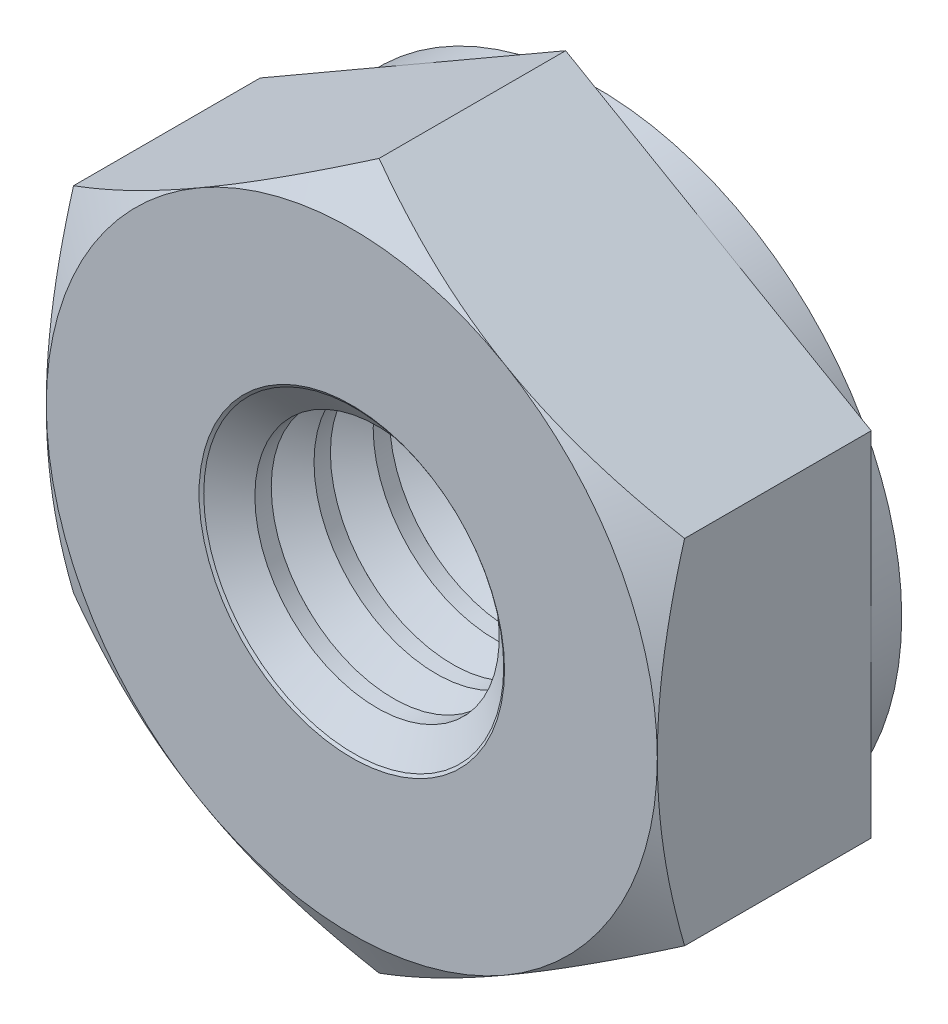
ISO-10303-21;
HEADER;
FILE_DESCRIPTION(('STEP AP214'),'2;1');
FILE_NAME('part.step','',(''),(''),'','','');
FILE_SCHEMA(('AUTOMOTIVE_DESIGN { 1 0 10303 214 1 1 1 1 }'));
ENDSEC;
DATA;
#1=APPLICATION_CONTEXT('core data for automotive mechanical design processes');
#2=APPLICATION_PROTOCOL_DEFINITION('international standard','automotive_design',2000,#1);
#3=PRODUCT_CONTEXT('',#1,'mechanical');
#4=PRODUCT('Part','Part','',(#3));
#5=PRODUCT_RELATED_PRODUCT_CATEGORY('part','',(#4));
#6=PRODUCT_DEFINITION_FORMATION('','',#4);
#7=PRODUCT_DEFINITION_CONTEXT('part definition',#1,'design');
#8=PRODUCT_DEFINITION('design','',#6,#7);
#9=PRODUCT_DEFINITION_SHAPE('','',#8);
#10=(LENGTH_UNIT() NAMED_UNIT(*) SI_UNIT(.MILLI.,.METRE.));
#11=(NAMED_UNIT(*) PLANE_ANGLE_UNIT() SI_UNIT($,.RADIAN.));
#12=(NAMED_UNIT(*) SI_UNIT($,.STERADIAN.) SOLID_ANGLE_UNIT());
#13=UNCERTAINTY_MEASURE_WITH_UNIT(LENGTH_MEASURE(1.E-05),#10,'distance_accuracy_value','');
#14=(GEOMETRIC_REPRESENTATION_CONTEXT(3) GLOBAL_UNCERTAINTY_ASSIGNED_CONTEXT((#13)) GLOBAL_UNIT_ASSIGNED_CONTEXT((#10,
#11,#12)) REPRESENTATION_CONTEXT('',''));
#15=CARTESIAN_POINT('',(0.,0.,0.));
#16=DIRECTION('',(0.,0.,1.));
#17=DIRECTION('',(1.,0.,0.));
#18=AXIS2_PLACEMENT_3D('',#15,#16,#17);
#19=CARTESIAN_POINT('',(0.,0.,-1.6));
#20=DIRECTION('',(0.,0.,1.));
#21=DIRECTION('',(1.,0.,0.));
#22=AXIS2_PLACEMENT_3D('',#19,#20,#21);
#23=CYLINDRICAL_SURFACE('',#22,0.8);
#24=CARTESIAN_POINT('',(0.,0.,-1.32734150764194));
#25=DIRECTION('',(0.,0.,-1.));
#26=DIRECTION('',(-1.,0.,0.));
#27=AXIS2_PLACEMENT_3D('',#24,#25,#26);
#28=CIRCLE('',#27,0.8);
#29=CARTESIAN_POINT('',(-0.8,0.,-1.32734150764194));
#30=VERTEX_POINT('',#29);
#31=EDGE_CURVE('E610',#30,#30,#28,.T.);
#32=ORIENTED_EDGE('',*,*,#31,.F.);
#33=EDGE_LOOP('',(#32));
#34=FACE_BOUND('',#33,.T.);
#35=CARTESIAN_POINT('',(0.,0.,-1.43455849235806));
#36=DIRECTION('',(0.,0.,-1.));
#37=DIRECTION('',(-1.,0.,0.));
#38=AXIS2_PLACEMENT_3D('',#35,#36,#37);
#39=CIRCLE('',#38,0.8);
#40=CARTESIAN_POINT('',(-0.8,0.,-1.43455849235806));
#41=VERTEX_POINT('',#40);
#42=EDGE_CURVE('E272',#41,#41,#39,.F.);
#43=ORIENTED_EDGE('',*,*,#42,.F.);
#44=EDGE_LOOP('',(#43));
#45=FACE_BOUND('',#44,.T.);
#46=ADVANCED_FACE('F35',(#34,#45),#23,.F.);
#47=CARTESIAN_POINT('',(0.,0.,-1.04725849235806));
#48=DIRECTION('',(0.,0.,-1.));
#49=DIRECTION('',(-1.,0.,0.));
#50=AXIS2_PLACEMENT_3D('',#47,#48,#49);
#51=CIRCLE('',#50,0.8);
#52=CARTESIAN_POINT('',(-0.8,0.,-1.04725849235806));
#53=VERTEX_POINT('',#52);
#54=EDGE_CURVE('E611',#53,#53,#51,.T.);
#55=ORIENTED_EDGE('',*,*,#54,.T.);
#56=EDGE_LOOP('',(#55));
#57=FACE_BOUND('',#56,.T.);
#58=CARTESIAN_POINT('',(0.,0.,-0.940041507641944));
#59=DIRECTION('',(0.,0.,-1.));
#60=DIRECTION('',(-1.,0.,0.));
#61=AXIS2_PLACEMENT_3D('',#58,#59,#60);
#62=CIRCLE('',#61,0.8);
#63=CARTESIAN_POINT('',(-0.8,0.,-0.940041507641944));
#64=VERTEX_POINT('',#63);
#65=EDGE_CURVE('E620',#64,#64,#62,.T.);
#66=ORIENTED_EDGE('',*,*,#65,.F.);
#67=EDGE_LOOP('',(#66));
#68=FACE_BOUND('',#67,.T.);
#69=ADVANCED_FACE('F228',(#57,#68),#23,.F.);
#70=CARTESIAN_POINT('',(0.,0.,-0.659958492358061));
#71=DIRECTION('',(0.,0.,-1.));
#72=DIRECTION('',(-1.,0.,0.));
#73=AXIS2_PLACEMENT_3D('',#70,#71,#72);
#74=CIRCLE('',#73,0.8);
#75=CARTESIAN_POINT('',(-0.8,0.,-0.659958492358061));
#76=VERTEX_POINT('',#75);
#77=EDGE_CURVE('E613',#76,#76,#74,.T.);
#78=ORIENTED_EDGE('',*,*,#77,.T.);
#79=EDGE_LOOP('',(#78));
#80=FACE_BOUND('',#79,.T.);
#81=CARTESIAN_POINT('',(0.,0.,-0.552741507641944));
#82=DIRECTION('',(0.,0.,-1.));
#83=DIRECTION('',(-1.,0.,0.));
#84=AXIS2_PLACEMENT_3D('',#81,#82,#83);
#85=CIRCLE('',#84,0.8);
#86=CARTESIAN_POINT('',(-0.8,0.,-0.552741507641944));
#87=VERTEX_POINT('',#86);
#88=EDGE_CURVE('E263',#87,#87,#85,.T.);
#89=ORIENTED_EDGE('',*,*,#88,.F.);
#90=EDGE_LOOP('',(#89));
#91=FACE_BOUND('',#90,.T.);
#92=ADVANCED_FACE('F235',(#80,#91),#23,.F.);
#93=CARTESIAN_POINT('',(0.,0.,-0.272658492358061));
#94=DIRECTION('',(0.,0.,-1.));
#95=DIRECTION('',(-1.,0.,0.));
#96=AXIS2_PLACEMENT_3D('',#93,#94,#95);
#97=CIRCLE('',#96,0.8);
#98=CARTESIAN_POINT('',(-0.8,0.,-0.272658492358061));
#99=VERTEX_POINT('',#98);
#100=EDGE_CURVE('E252',#99,#99,#97,.T.);
#101=ORIENTED_EDGE('',*,*,#100,.T.);
#102=EDGE_LOOP('',(#101));
#103=FACE_BOUND('',#102,.T.);
#104=CARTESIAN_POINT('',(0.,0.,-0.165441507641944));
#105=DIRECTION('',(0.,0.,-1.));
#106=DIRECTION('',(-1.,0.,0.));
#107=AXIS2_PLACEMENT_3D('',#104,#105,#106);
#108=CIRCLE('',#107,0.8);
#109=CARTESIAN_POINT('',(-0.8,0.,-0.165441507641944));
#110=VERTEX_POINT('',#109);
#111=EDGE_CURVE('E255',#110,#110,#108,.T.);
#112=ORIENTED_EDGE('',*,*,#111,.F.);
#113=EDGE_LOOP('',(#112));
#114=FACE_BOUND('',#113,.T.);
#115=ADVANCED_FACE('F231',(#103,#114),#23,.F.);
#116=CARTESIAN_POINT('',(-3.99999999999995,0.,-1.6));
#117=DIRECTION('',(0.,0.,1.));
#118=DIRECTION('',(1.,0.,0.));
#119=AXIS2_PLACEMENT_3D('',#116,#117,#118);
#120=PLANE('',#119);
#121=CARTESIAN_POINT('',(0.,0.,-1.6));
#122=DIRECTION('',(0.,0.,1.));
#123=DIRECTION('',(1.,0.,0.));
#124=AXIS2_PLACEMENT_3D('',#121,#122,#123);
#125=CIRCLE('',#124,2.);
#126=CARTESIAN_POINT('',(2.,0.,-1.6));
#127=VERTEX_POINT('',#126);
#128=EDGE_CURVE('E285',#127,#127,#125,.F.);
#129=ORIENTED_EDGE('',*,*,#128,.T.);
#130=EDGE_LOOP('',(#129));
#131=FACE_BOUND('',#130,.T.);
#132=CARTESIAN_POINT('',(0.,0.,-1.6));
#133=DIRECTION('',(0.,0.,1.));
#134=DIRECTION('',(1.,0.,0.));
#135=AXIS2_PLACEMENT_3D('',#132,#133,#134);
#136=CIRCLE('',#135,1.);
#137=CARTESIAN_POINT('',(1.,0.,-1.6));
#138=VERTEX_POINT('',#137);
#139=EDGE_CURVE('E270',#138,#138,#136,.F.);
#140=ORIENTED_EDGE('',*,*,#139,.F.);
#141=EDGE_LOOP('',(#140));
#142=FACE_BOUND('',#141,.T.);
#143=ADVANCED_FACE('F241',(#131,#142),#120,.F.);
#144=CARTESIAN_POINT('',(-3.99999999999995,0.,0.));
#145=DIRECTION('',(0.,0.,1.));
#146=DIRECTION('',(1.,0.,0.));
#147=AXIS2_PLACEMENT_3D('',#144,#145,#146);
#148=PLANE('',#147);
#149=CARTESIAN_POINT('',(0.,0.,0.));
#150=DIRECTION('',(0.,0.,1.));
#151=DIRECTION('',(1.,0.,0.));
#152=AXIS2_PLACEMENT_3D('',#149,#150,#151);
#153=CIRCLE('',#152,2.);
#154=CARTESIAN_POINT('',(2.,0.,0.));
#155=VERTEX_POINT('',#154);
#156=CARTESIAN_POINT('',(1.00000000000002,-1.73205080756887,0.));
#157=VERTEX_POINT('',#156);
#158=EDGE_CURVE('E11',#155,#157,#153,.F.);
#159=ORIENTED_EDGE('',*,*,#158,.F.);
#160=CARTESIAN_POINT('',(0.,0.,0.));
#161=DIRECTION('',(0.,0.,1.));
#162=DIRECTION('',(1.,0.,0.));
#163=AXIS2_PLACEMENT_3D('',#160,#161,#162);
#164=CIRCLE('',#163,2.);
#165=CARTESIAN_POINT('',(1.00000000000002,1.73205080756886,0.));
#166=VERTEX_POINT('',#165);
#167=EDGE_CURVE('E144',#155,#166,#164,.T.);
#168=ORIENTED_EDGE('',*,*,#167,.T.);
#169=CARTESIAN_POINT('',(-1.00000000000002,1.73205080756887,0.));
#170=VERTEX_POINT('',#169);
#171=EDGE_CURVE('E47',#170,#166,#153,.F.);
#172=ORIENTED_EDGE('',*,*,#171,.F.);
#173=CARTESIAN_POINT('',(-2.,0.,0.));
#174=VERTEX_POINT('',#173);
#175=EDGE_CURVE('E349',#174,#170,#153,.F.);
#176=ORIENTED_EDGE('',*,*,#175,.F.);
#177=CARTESIAN_POINT('',(-1.00000000000003,-1.73205080756886,0.));
#178=VERTEX_POINT('',#177);
#179=EDGE_CURVE('E350',#178,#174,#153,.F.);
#180=ORIENTED_EDGE('',*,*,#179,.F.);
#181=EDGE_CURVE('E45',#157,#178,#153,.F.);
#182=ORIENTED_EDGE('',*,*,#181,.F.);
#183=EDGE_LOOP('',(#159,#168,#172,#176,#180,#182));
#184=FACE_BOUND('',#183,.T.);
#185=CARTESIAN_POINT('',(0.,0.,0.));
#186=DIRECTION('',(0.,0.,1.));
#187=DIRECTION('',(1.,0.,0.));
#188=AXIS2_PLACEMENT_3D('',#185,#186,#187);
#189=CIRCLE('',#188,1.);
#190=CARTESIAN_POINT('',(1.,0.,0.));
#191=VERTEX_POINT('',#190);
#192=EDGE_CURVE('E152',#191,#191,#189,.T.);
#193=ORIENTED_EDGE('',*,*,#192,.F.);
#194=EDGE_LOOP('',(#193));
#195=FACE_BOUND('',#194,.T.);
#196=ADVANCED_FACE('F154',(#184,#195),#148,.T.);
#197=CARTESIAN_POINT('',(0.,2.30940107675852,-1.6));
#198=DIRECTION('',(-0.50000000000001,0.866025403784433,0.));
#199=DIRECTION('',(-0.866025403784433,-0.50000000000001,0.));
#200=AXIS2_PLACEMENT_3D('',#197,#198,#199);
#201=PLANE('',#200);
#202=DIRECTION('',(0.,0.,1.));
#203=VECTOR('',#202,1.);
#204=CARTESIAN_POINT('',(-2.,1.15470053837924,-1.6));
#205=LINE('',#204,#203);
#206=CARTESIAN_POINT('',(-2.,1.15470053837924,-1.4));
#207=VERTEX_POINT('',#206);
#208=CARTESIAN_POINT('',(-2.,1.15470053837924,-0.17863279495409));
#209=VERTEX_POINT('',#208);
#210=EDGE_CURVE('E289',#207,#209,#205,.T.);
#211=ORIENTED_EDGE('',*,*,#210,.T.);
#212=CARTESIAN_POINT('',(-2.0002,1.1545850683254,-0.178699466620493));
#213=CARTESIAN_POINT('',(-1.91230873709994,1.20532911262017,-0.149389536100674));
#214=CARTESIAN_POINT('',(-1.82365880552641,1.25651117447779,-0.122732851980462));
#215=CARTESIAN_POINT('',(-1.6448237530022,1.35976164019318,-0.0762024910207172));
#216=CARTESIAN_POINT('',(-1.55463545349497,1.41183187919144,-0.0563452763827756));
#217=CARTESIAN_POINT('',(-1.3753766142367,1.51532701829182,-0.0254334640232498));
#218=CARTESIAN_POINT('',(-1.2863336617737,1.56673599086578,-0.014173151598529));
#219=CARTESIAN_POINT('',(-1.10782860221496,1.66979593505373,-0.000728662594640663));
#220=CARTESIAN_POINT('',(-1.01836714429605,1.72144653186531,0.00146664504653274));
#221=CARTESIAN_POINT('',(-0.851191646451209,1.81796535054794,-0.00309098933064855));
#222=CARTESIAN_POINT('',(-0.773452629734223,1.86284799277603,-0.00872487468701488));
#223=CARTESIAN_POINT('',(-0.618481085463872,1.95232085557725,-0.02658389526083));
#224=CARTESIAN_POINT('',(-0.541249094258806,1.99691076648955,-0.0388151360234418));
#225=CARTESIAN_POINT('',(-0.385957813517802,2.08656822922817,-0.069393436867614));
#226=CARTESIAN_POINT('',(-0.307918186892623,2.13162442866768,-0.087870167065721));
#227=CARTESIAN_POINT('',(-0.153003134307866,2.22106467597901,-0.129805518212863));
#228=CARTESIAN_POINT('',(-0.0761257223768796,2.26544987045197,-0.153254280492322));
#229=CARTESIAN_POINT('',(0.000200000000001074,2.30951654681236,-0.178699466620507));
#230=B_SPLINE_CURVE_WITH_KNOTS('',3,(#212,#213,#214,#215,#216,#217,#218,#219,#220,#221,#222,
#223,#224,#225,#226,#227,#228,#229),.UNSPECIFIED.,.F.,.F.,(4,2,2,2,2,2,2,2,4),(0.,
0.317031824695609,0.634825876346562,0.944753967652633,1.25430138000371,1.52387047293094,
1.79368946861029,2.06949491027635,2.34475850821474),.UNSPECIFIED.);
#231=EDGE_CURVE('E138',#209,#170,#230,.T.);
#232=ORIENTED_EDGE('',*,*,#231,.T.);
#233=CARTESIAN_POINT('',(0.,2.30940107675852,-0.17863279495409));
#234=VERTEX_POINT('',#233);
#235=EDGE_CURVE('E166',#170,#234,#230,.T.);
#236=ORIENTED_EDGE('',*,*,#235,.T.);
#237=DIRECTION('',(0.,0.,1.));
#238=VECTOR('',#237,1.);
#239=CARTESIAN_POINT('',(0.,2.30940107675852,-1.6));
#240=LINE('',#239,#238);
#241=CARTESIAN_POINT('',(0.,2.30940107675852,-1.4));
#242=VERTEX_POINT('',#241);
#243=EDGE_CURVE('E288',#242,#234,#240,.T.);
#244=ORIENTED_EDGE('',*,*,#243,.F.);
#245=DIRECTION('',(-0.866025403784433,-0.50000000000001,0.));
#246=VECTOR('',#245,1.);
#247=CARTESIAN_POINT('',(0.,2.30940107675852,-1.4));
#248=LINE('',#247,#246);
#249=CARTESIAN_POINT('',(-1.00000000000002,1.73205080756887,-1.40000000000001));
#250=VERTEX_POINT('',#249);
#251=EDGE_CURVE('E317',#242,#250,#248,.T.);
#252=ORIENTED_EDGE('',*,*,#251,.T.);
#253=EDGE_CURVE('E314',#250,#207,#248,.T.);
#254=ORIENTED_EDGE('',*,*,#253,.T.);
#255=EDGE_LOOP('',(#211,#232,#236,#244,#252,#254));
#256=FACE_BOUND('',#255,.T.);
#257=ADVANCED_FACE('F37',(#256),#201,.T.);
#258=CARTESIAN_POINT('',(2.,1.15470053837923,-1.6));
#259=DIRECTION('',(0.500000000000012,0.866025403784432,0.));
#260=DIRECTION('',(-0.866025403784432,0.500000000000012,0.));
#261=AXIS2_PLACEMENT_3D('',#258,#259,#260);
#262=PLANE('',#261);
#263=ORIENTED_EDGE('',*,*,#243,.T.);
#264=CARTESIAN_POINT('',(-0.00019999999999892,2.30951654681236,-0.178699466620507));
#265=CARTESIAN_POINT('',(0.0876912629000607,2.25877250251759,-0.149389536100687));
#266=CARTESIAN_POINT('',(0.176341194473592,2.20759044065997,-0.122732851980474));
#267=CARTESIAN_POINT('',(0.355176246997802,2.10433997494457,-0.0762024910207263));
#268=CARTESIAN_POINT('',(0.445364546505037,2.05226973594631,-0.0563452763827833));
#269=CARTESIAN_POINT('',(0.624623385763306,1.94877459684593,-0.0254334640232546));
#270=CARTESIAN_POINT('',(0.713666338226303,1.89736562427198,-0.0141731515985322));
#271=CARTESIAN_POINT('',(0.892171397785042,1.79430568008402,-0.000728662594640951));
#272=CARTESIAN_POINT('',(0.981632855703957,1.74265508327244,0.00146664504653372));
#273=CARTESIAN_POINT('',(1.1488083535488,1.64613626458981,-0.00309098933064549));
#274=CARTESIAN_POINT('',(1.22654737026578,1.60125362236172,-0.00872487468701085));
#275=CARTESIAN_POINT('',(1.38151891453613,1.5117807595605,-0.0265838952608238));
#276=CARTESIAN_POINT('',(1.4587509057412,1.4671908486482,-0.0388151360234344));
#277=CARTESIAN_POINT('',(1.6140421864822,1.37753338590958,-0.0693934368676044));
#278=CARTESIAN_POINT('',(1.69208181310738,1.33247718647007,-0.0878701670657104));
#279=CARTESIAN_POINT('',(1.84699686569214,1.24303693915874,-0.12980551821285));
#280=CARTESIAN_POINT('',(1.92387427762312,1.19865174468578,-0.153254280492308));
#281=CARTESIAN_POINT('',(2.0002,1.15458506832539,-0.178699466620492));
#282=B_SPLINE_CURVE_WITH_KNOTS('',3,(#264,#265,#266,#267,#268,#269,#270,#271,#272,#273,#274,
#275,#276,#277,#278,#279,#280,#281),.UNSPECIFIED.,.F.,.F.,(4,2,2,2,2,2,2,2,4),(0.,
0.317031824695613,0.634825876346569,0.944753967652643,1.25430138000372,1.52387047293095,
1.7936894686103,2.06949491027636,2.34475850821474),.UNSPECIFIED.);
#283=EDGE_CURVE('E162',#234,#166,#282,.T.);
#284=ORIENTED_EDGE('',*,*,#283,.T.);
#285=CARTESIAN_POINT('',(2.,1.15470053837928,-0.17863279495409));
#286=VERTEX_POINT('',#285);
#287=EDGE_CURVE('E147',#166,#286,#282,.T.);
#288=ORIENTED_EDGE('',*,*,#287,.T.);
#289=DIRECTION('',(0.,0.,1.));
#290=VECTOR('',#289,1.);
#291=CARTESIAN_POINT('',(2.,1.15470053837923,-1.6));
#292=LINE('',#291,#290);
#293=CARTESIAN_POINT('',(2.,1.15470053837923,-1.4));
#294=VERTEX_POINT('',#293);
#295=EDGE_CURVE('E161',#294,#286,#292,.T.);
#296=ORIENTED_EDGE('',*,*,#295,.F.);
#297=DIRECTION('',(-0.866025403784432,0.500000000000012,0.));
#298=VECTOR('',#297,1.);
#299=CARTESIAN_POINT('',(2.,1.15470053837923,-1.4));
#300=LINE('',#299,#298);
#301=CARTESIAN_POINT('',(1.00000000000002,1.73205080756886,-1.40000000000001));
#302=VERTEX_POINT('',#301);
#303=EDGE_CURVE('E309',#294,#302,#300,.T.);
#304=ORIENTED_EDGE('',*,*,#303,.T.);
#305=EDGE_CURVE('E306',#302,#242,#300,.T.);
#306=ORIENTED_EDGE('',*,*,#305,.T.);
#307=EDGE_LOOP('',(#263,#284,#288,#296,#304,#306));
#308=FACE_BOUND('',#307,.T.);
#309=ADVANCED_FACE('F328',(#308),#262,.T.);
#310=CARTESIAN_POINT('',(2.,1.15470053837923,-1.6));
#311=DIRECTION('',(-1.,0.,0.));
#312=DIRECTION('',(0.,0.,1.));
#313=AXIS2_PLACEMENT_3D('',#310,#311,#312);
#314=PLANE('',#313);
#315=CARTESIAN_POINT('',(2.,-3.06243599497951,-0.957053410620342));
#316=CARTESIAN_POINT('',(2.,-2.97462468513206,-0.914618135332473));
#317=CARTESIAN_POINT('',(2.,-2.88660576044579,-0.872604701878219));
#318=CARTESIAN_POINT('',(2.,-2.71004042392051,-0.789662573424108));
#319=CARTESIAN_POINT('',(2.,-2.62149392396107,-0.748734066234652));
#320=CARTESIAN_POINT('',(2.,-2.44328285836997,-0.66798723147799));
#321=CARTESIAN_POINT('',(2.,-2.35361479423024,-0.628176597351518));
#322=CARTESIAN_POINT('',(2.,-2.17354167395296,-0.550265292890177));
#323=CARTESIAN_POINT('',(2.,-2.08313665652239,-0.512164533422748));
#324=CARTESIAN_POINT('',(2.,-1.90031404940489,-0.437671460362114));
#325=CARTESIAN_POINT('',(2.,-1.80788540023437,-0.401306140224343));
#326=CARTESIAN_POINT('',(2.,-1.62195694964765,-0.331431205515088));
#327=CARTESIAN_POINT('',(2.,-1.52845725096661,-0.297921319609415));
#328=CARTESIAN_POINT('',(2.,-1.34040158791137,-0.234645877627155));
#329=CARTESIAN_POINT('',(2.,-1.24584820361337,-0.204872731943697));
#330=CARTESIAN_POINT('',(2.,-1.05539728812546,-0.150041663725107));
#331=CARTESIAN_POINT('',(2.,-0.959500192348599,-0.124982250068521));
#332=CARTESIAN_POINT('',(2.,-0.76629610705621,-0.0807954522614587));
#333=CARTESIAN_POINT('',(2.,-0.668988749343086,-0.0616696475902453));
#334=CARTESIAN_POINT('',(2.,-0.473201573751693,-0.0306369133490262));
#335=CARTESIAN_POINT('',(2.,-0.374721754836899,-0.0187299901614191));
#336=CARTESIAN_POINT('',(2.,-0.177725213014489,-0.0031916653596869));
#337=CARTESIAN_POINT('',(2.,-0.0792127464696248,0.000492126942977835));
#338=CARTESIAN_POINT('',(2.,0.117733134481516,-0.000599210482844799));
#339=CARTESIAN_POINT('',(2.,0.216166562771015,-0.00537214444610875));
#340=CARTESIAN_POINT('',(2.,0.454297223248096,-0.0267243139120234));
#341=CARTESIAN_POINT('',(2.,0.593620477818509,-0.0474829418890599));
#342=CARTESIAN_POINT('',(2.,0.86968930625474,-0.102199494270672));
#343=CARTESIAN_POINT('',(2.,1.00643164818018,-0.136172948124195));
#344=CARTESIAN_POINT('',(2.,1.21108706615391,-0.194758945655351));
#345=CARTESIAN_POINT('',(2.,1.28004655189498,-0.215857177032555));
#346=CARTESIAN_POINT('',(2.,1.41724192464568,-0.260142084128316));
#347=CARTESIAN_POINT('',(2.,1.48547827495745,-0.283327319381144));
#348=CARTESIAN_POINT('',(2.,1.62094688255349,-0.331302907971955));
#349=CARTESIAN_POINT('',(2.,1.68818262968751,-0.356083492073587));
#350=CARTESIAN_POINT('',(2.,1.8221324658763,-0.4070991476866));
#351=CARTESIAN_POINT('',(2.,1.88884633148561,-0.43333480705231));
#352=CARTESIAN_POINT('',(2.,1.95531849493338,-0.460154503270878));
#353=B_SPLINE_CURVE_WITH_KNOTS('',3,(#315,#316,#317,#318,#319,#320,#321,#322,#323,#324,#325,
#326,#327,#328,#329,#330,#331,#332,#333,#334,#335,#336,#337,#338,#339,#340,#341,#342,#343,#344,
#345,#346,#347,#348,#349,#350,#351,#352),.UNSPECIFIED.,.F.,.F.,(4,2,2,2,2,2,2,2,2,2,2,2,2,2,2,2,
2,2,4),(0.,0.292585896266137,0.585222115299638,0.879532973229954,1.17382847142414,
1.47176772581359,1.76967863724008,2.06697432467464,2.36417580814399,2.66145633652587,
2.95873712774071,3.25411843045683,3.54942304948608,3.97114178181686,4.3933576029618,
4.6096765556511,4.82584733174414,5.0408013534775,5.25584285892499),.UNSPECIFIED.);
#354=CARTESIAN_POINT('',(1.99999999999999,-1.1547005383793,-0.17863279495409));
#355=VERTEX_POINT('',#354);
#356=EDGE_CURVE('E127',#355,#155,#353,.T.);
#357=ORIENTED_EDGE('',*,*,#356,.F.);
#358=DIRECTION('',(0.,0.,1.));
#359=VECTOR('',#358,1.);
#360=CARTESIAN_POINT('',(2.,-1.15470053837929,-1.6));
#361=LINE('',#360,#359);
#362=CARTESIAN_POINT('',(2.,-1.15470053837929,-1.4));
#363=VERTEX_POINT('',#362);
#364=EDGE_CURVE('E298',#363,#355,#361,.T.);
#365=ORIENTED_EDGE('',*,*,#364,.F.);
#366=DIRECTION('',(0.,-1.,0.));
#367=VECTOR('',#366,1.);
#368=CARTESIAN_POINT('',(2.,1.15470053837923,-1.4));
#369=LINE('',#368,#367);
#370=CARTESIAN_POINT('',(2.,0.,-1.40000000000001));
#371=VERTEX_POINT('',#370);
#372=EDGE_CURVE('E303',#371,#363,#369,.T.);
#373=ORIENTED_EDGE('',*,*,#372,.F.);
#374=EDGE_CURVE('E293',#294,#371,#369,.T.);
#375=ORIENTED_EDGE('',*,*,#374,.F.);
#376=ORIENTED_EDGE('',*,*,#295,.T.);
#377=EDGE_CURVE('E140',#155,#286,#353,.T.);
#378=ORIENTED_EDGE('',*,*,#377,.F.);
#379=EDGE_LOOP('',(#357,#365,#373,#375,#376,#378));
#380=FACE_BOUND('',#379,.T.);
#381=ADVANCED_FACE('F158',(#380),#314,.F.);
#382=CARTESIAN_POINT('',(0.,-2.30940107675858,-1.6));
#383=DIRECTION('',(0.500000000000011,-0.866025403784432,0.));
#384=DIRECTION('',(0.866025403784433,0.500000000000011,0.));
#385=AXIS2_PLACEMENT_3D('',#382,#383,#384);
#386=PLANE('',#385);
#387=ORIENTED_EDGE('',*,*,#364,.T.);
#388=CARTESIAN_POINT('',(2.0002,-1.15458506832545,-0.178699466620511));
#389=CARTESIAN_POINT('',(1.91230873709994,-1.20532911262022,-0.149389536100692));
#390=CARTESIAN_POINT('',(1.82365880552641,-1.25651117447784,-0.122732851980481));
#391=CARTESIAN_POINT('',(1.6448237530022,-1.35976164019324,-0.0762024910207378));
#392=CARTESIAN_POINT('',(1.55463545349496,-1.4118318791915,-0.0563452763827973));
#393=CARTESIAN_POINT('',(1.37537661423669,-1.51532701829188,-0.0254334640232735));
#394=CARTESIAN_POINT('',(1.28633366177369,-1.56673599086584,-0.0141731515985537));
#395=CARTESIAN_POINT('',(1.10782860221495,-1.66979593505379,-0.000728662594667832));
#396=CARTESIAN_POINT('',(1.01836714429604,-1.72144653186537,0.00146664504650393));
#397=CARTESIAN_POINT('',(0.851191646451198,-1.817965350548,-0.0030909893306799));
#398=CARTESIAN_POINT('',(0.773452629734212,-1.86284799277609,-0.008724874687047));
#399=CARTESIAN_POINT('',(0.618481085463863,-1.95232085557731,-0.0265838952608635));
#400=CARTESIAN_POINT('',(0.541249094258798,-1.99691076648961,-0.0388151360234758));
#401=CARTESIAN_POINT('',(0.385957813517797,-2.08656822922823,-0.0693934368676486));
#402=CARTESIAN_POINT('',(0.307918186892618,-2.13162442866774,-0.0878701670657557));
#403=CARTESIAN_POINT('',(0.153003134307864,-2.22106467597907,-0.129805518212897));
#404=CARTESIAN_POINT('',(0.0761257223768787,-2.26544987045203,-0.153254280492356));
#405=CARTESIAN_POINT('',(-0.000200000000000946,-2.30951654681242,-0.178699466620541));
#406=B_SPLINE_CURVE_WITH_KNOTS('',3,(#388,#389,#390,#391,#392,#393,#394,#395,#396,#397,#398,
#399,#400,#401,#402,#403,#404,#405),.UNSPECIFIED.,.F.,.F.,(4,2,2,2,2,2,2,2,4),(0.,
0.317031824695613,0.63482587634657,0.944753967652646,1.25430138000373,1.52387047293095,
1.7936894686103,2.06949491027636,2.34475850821474),.UNSPECIFIED.);
#407=EDGE_CURVE('E133',#355,#157,#406,.T.);
#408=ORIENTED_EDGE('',*,*,#407,.T.);
#409=CARTESIAN_POINT('',(-1.03866568124111E-13,-2.30940107675852,-0.17863279495409));
#410=VERTEX_POINT('',#409);
#411=EDGE_CURVE('E54',#157,#410,#406,.T.);
#412=ORIENTED_EDGE('',*,*,#411,.T.);
#413=DIRECTION('',(0.,0.,1.));
#414=VECTOR('',#413,1.);
#415=CARTESIAN_POINT('',(0.,-2.30940107675858,-1.6));
#416=LINE('',#415,#414);
#417=CARTESIAN_POINT('',(0.,-2.30940107675858,-1.4));
#418=VERTEX_POINT('',#417);
#419=EDGE_CURVE('E295',#418,#410,#416,.T.);
#420=ORIENTED_EDGE('',*,*,#419,.F.);
#421=DIRECTION('',(0.866025403784433,0.500000000000011,0.));
#422=VECTOR('',#421,1.);
#423=CARTESIAN_POINT('',(0.,-2.30940107675858,-1.4));
#424=LINE('',#423,#422);
#425=CARTESIAN_POINT('',(1.00000000000005,-1.73205080756891,-1.40000000000001));
#426=VERTEX_POINT('',#425);
#427=EDGE_CURVE('E310',#418,#426,#424,.T.);
#428=ORIENTED_EDGE('',*,*,#427,.T.);
#429=EDGE_CURVE('E305',#426,#363,#424,.T.);
#430=ORIENTED_EDGE('',*,*,#429,.T.);
#431=EDGE_LOOP('',(#387,#408,#412,#420,#428,#430));
#432=FACE_BOUND('',#431,.T.);
#433=ADVANCED_FACE('F214',(#432),#386,.T.);
#434=CARTESIAN_POINT('',(-2.,-1.15470053837928,-1.6));
#435=DIRECTION('',(-0.500000000000014,-0.86602540378443,0.));
#436=DIRECTION('',(0.866025403784431,-0.500000000000014,0.));
#437=AXIS2_PLACEMENT_3D('',#434,#435,#436);
#438=PLANE('',#437);
#439=ORIENTED_EDGE('',*,*,#419,.T.);
#440=CARTESIAN_POINT('',(0.000199999999999335,-2.30951654681242,-0.178699466620541));
#441=CARTESIAN_POINT('',(-0.0876912629000625,-2.25877250251765,-0.14938953610072));
#442=CARTESIAN_POINT('',(-0.176341194473596,-2.20759044066002,-0.122732851980506));
#443=CARTESIAN_POINT('',(-0.35517624699781,-2.10433997494462,-0.0762024910207569));
#444=CARTESIAN_POINT('',(-0.445364546505047,-2.05226973594636,-0.0563452763828134));
#445=CARTESIAN_POINT('',(-0.62462338576332,-1.94877459684598,-0.0254334640232837));
#446=CARTESIAN_POINT('',(-0.71366633822632,-1.89736562427202,-0.0141731515985608));
#447=CARTESIAN_POINT('',(-0.892171397785063,-1.79430568008407,-0.000728662594669002));
#448=CARTESIAN_POINT('',(-0.98163285570398,-1.74265508327248,0.00146664504650571));
#449=CARTESIAN_POINT('',(-1.14880835354882,-1.64613626458985,-0.00309098933067304));
#450=CARTESIAN_POINT('',(-1.2265473702658,-1.60125362236176,-0.0087248746870376));
#451=CARTESIAN_POINT('',(-1.38151891453615,-1.51178075956054,-0.0265838952608489));
#452=CARTESIAN_POINT('',(-1.45875090574121,-1.46719084864825,-0.0388151360234586));
#453=CARTESIAN_POINT('',(-1.61404218648221,-1.37753338590963,-0.0693934368676262));
#454=CARTESIAN_POINT('',(-1.69208181310739,-1.33247718647012,-0.0878701670657307));
#455=CARTESIAN_POINT('',(-1.84699686569214,-1.24303693915879,-0.129805518212867));
#456=CARTESIAN_POINT('',(-1.92387427762312,-1.19865174468583,-0.153254280492323));
#457=CARTESIAN_POINT('',(-2.0002,-1.15458506832545,-0.178699466620506));
#458=B_SPLINE_CURVE_WITH_KNOTS('',3,(#440,#441,#442,#443,#444,#445,#446,#447,#448,#449,#450,
#451,#452,#453,#454,#455,#456,#457),.UNSPECIFIED.,.F.,.F.,(4,2,2,2,2,2,2,2,4),(0.,
0.31703182469562,0.634825876346584,0.944753967652667,1.25430138000375,1.52387047293097,
1.79368946861031,2.06949491027636,2.34475850821474),.UNSPECIFIED.);
#459=EDGE_CURVE('E208',#410,#178,#458,.T.);
#460=ORIENTED_EDGE('',*,*,#459,.T.);
#461=CARTESIAN_POINT('',(-2.,-1.15470053837929,-0.17863279495409));
#462=VERTEX_POINT('',#461);
#463=EDGE_CURVE('E61',#178,#462,#458,.T.);
#464=ORIENTED_EDGE('',*,*,#463,.T.);
#465=DIRECTION('',(0.,0.,1.));
#466=VECTOR('',#465,1.);
#467=CARTESIAN_POINT('',(-2.,-1.15470053837928,-1.6));
#468=LINE('',#467,#466);
#469=CARTESIAN_POINT('',(-2.,-1.15470053837928,-1.4));
#470=VERTEX_POINT('',#469);
#471=EDGE_CURVE('E292',#470,#462,#468,.T.);
#472=ORIENTED_EDGE('',*,*,#471,.F.);
#473=DIRECTION('',(0.866025403784431,-0.500000000000014,0.));
#474=VECTOR('',#473,1.);
#475=CARTESIAN_POINT('',(-2.,-1.15470053837928,-1.4));
#476=LINE('',#475,#474);
#477=CARTESIAN_POINT('',(-1.00000000000005,-1.7320508075689,-1.40000000000001));
#478=VERTEX_POINT('',#477);
#479=EDGE_CURVE('E318',#470,#478,#476,.T.);
#480=ORIENTED_EDGE('',*,*,#479,.T.);
#481=EDGE_CURVE('E313',#478,#418,#476,.T.);
#482=ORIENTED_EDGE('',*,*,#481,.T.);
#483=EDGE_LOOP('',(#439,#460,#464,#472,#480,#482));
#484=FACE_BOUND('',#483,.T.);
#485=ADVANCED_FACE('F210',(#484),#438,.T.);
#486=CARTESIAN_POINT('',(-2.,1.15470053837924,-1.6));
#487=DIRECTION('',(-1.,0.,0.));
#488=DIRECTION('',(0.,0.,1.));
#489=AXIS2_PLACEMENT_3D('',#486,#487,#488);
#490=PLANE('',#489);
#491=ORIENTED_EDGE('',*,*,#471,.T.);
#492=CARTESIAN_POINT('',(-2.,-3.06243599497949,-0.957053410620335));
#493=CARTESIAN_POINT('',(-2.,-2.97462468513205,-0.914618135332466));
#494=CARTESIAN_POINT('',(-2.,-2.88660576044578,-0.872604701878212));
#495=CARTESIAN_POINT('',(-2.,-2.7100404239205,-0.789662573424101));
#496=CARTESIAN_POINT('',(-2.,-2.62149392396106,-0.748734066234645));
#497=CARTESIAN_POINT('',(-2.,-2.44328285836996,-0.667987231477983));
#498=CARTESIAN_POINT('',(-2.,-2.35361479423023,-0.628176597351512));
#499=CARTESIAN_POINT('',(-2.,-2.17354167395295,-0.550265292890171));
#500=CARTESIAN_POINT('',(-2.,-2.08313665652238,-0.512164533422742));
#501=CARTESIAN_POINT('',(-2.,-1.90031404940488,-0.437671460362108));
#502=CARTESIAN_POINT('',(-2.,-1.80788540023436,-0.401306140224337));
#503=CARTESIAN_POINT('',(-2.,-1.62195694964764,-0.331431205515083));
#504=CARTESIAN_POINT('',(-2.,-1.52845725096661,-0.29792131960941));
#505=CARTESIAN_POINT('',(-2.,-1.34040158791137,-0.23464587762715));
#506=CARTESIAN_POINT('',(-2.,-1.24584820361336,-0.204872731943692));
#507=CARTESIAN_POINT('',(-2.,-1.05539728812545,-0.150041663725103));
#508=CARTESIAN_POINT('',(-2.,-0.95950019234859,-0.124982250068517));
#509=CARTESIAN_POINT('',(-2.,-0.766296107056202,-0.0807954522614552));
#510=CARTESIAN_POINT('',(-2.,-0.668988749343079,-0.061669647590242));
#511=CARTESIAN_POINT('',(-2.,-0.473201573751686,-0.0306369133490231));
#512=CARTESIAN_POINT('',(-2.,-0.374721754836892,-0.0187299901614161));
#513=CARTESIAN_POINT('',(-2.,-0.177725213014482,-0.00319166535968439));
#514=CARTESIAN_POINT('',(-2.,-0.0792127464696188,0.000492126942980013));
#515=CARTESIAN_POINT('',(-2.,0.117733134481521,-0.000599210482842971));
#516=CARTESIAN_POINT('',(-2.,0.21616656277102,-0.00537214444610695));
#517=CARTESIAN_POINT('',(-2.,0.4542972232481,-0.0267243139120217));
#518=CARTESIAN_POINT('',(-2.,0.593620477818513,-0.0474829418890585));
#519=CARTESIAN_POINT('',(-2.,0.869689306254743,-0.102199494270671));
#520=CARTESIAN_POINT('',(-2.,1.00643164818019,-0.136172948124194));
#521=CARTESIAN_POINT('',(-2.,1.21108706615391,-0.19475894565535));
#522=CARTESIAN_POINT('',(-2.,1.28004655189498,-0.215857177032554));
#523=CARTESIAN_POINT('',(-2.,1.41724192464568,-0.260142084128315));
#524=CARTESIAN_POINT('',(-2.,1.48547827495745,-0.283327319381144));
#525=CARTESIAN_POINT('',(-2.,1.6209468825535,-0.331302907971955));
#526=CARTESIAN_POINT('',(-2.,1.68818262968751,-0.356083492073587));
#527=CARTESIAN_POINT('',(-2.,1.82213246587631,-0.4070991476866));
#528=CARTESIAN_POINT('',(-2.,1.88884633148561,-0.433334807052311));
#529=CARTESIAN_POINT('',(-2.,1.95531849493338,-0.460154503270879));
#530=B_SPLINE_CURVE_WITH_KNOTS('',3,(#492,#493,#494,#495,#496,#497,#498,#499,#500,#501,#502,
#503,#504,#505,#506,#507,#508,#509,#510,#511,#512,#513,#514,#515,#516,#517,#518,#519,#520,#521,
#522,#523,#524,#525,#526,#527,#528,#529),.UNSPECIFIED.,.F.,.F.,(4,2,2,2,2,2,2,2,2,2,2,2,2,2,2,2,
2,2,4),(0.,0.292585896266137,0.585222115299637,0.879532973229952,1.17382847142414,
1.47176772581358,1.76967863724008,2.06697432467463,2.36417580814399,2.66145633652586,
2.9587371277407,3.25411843045682,3.54942304948607,3.97114178181685,4.39335760296179,
4.60967655565109,4.82584733174413,5.04080135347749,5.25584285892498),.UNSPECIFIED.);
#531=EDGE_CURVE('E209',#462,#174,#530,.T.);
#532=ORIENTED_EDGE('',*,*,#531,.T.);
#533=EDGE_CURVE('E151',#174,#209,#530,.T.);
#534=ORIENTED_EDGE('',*,*,#533,.T.);
#535=ORIENTED_EDGE('',*,*,#210,.F.);
#536=DIRECTION('',(0.,-1.,0.));
#537=VECTOR('',#536,1.);
#538=CARTESIAN_POINT('',(-2.,1.15470053837924,-1.4));
#539=LINE('',#538,#537);
#540=CARTESIAN_POINT('',(-2.,0.,-1.40000000000001));
#541=VERTEX_POINT('',#540);
#542=EDGE_CURVE('E284',#207,#541,#539,.T.);
#543=ORIENTED_EDGE('',*,*,#542,.T.);
#544=EDGE_CURVE('E281',#541,#470,#539,.T.);
#545=ORIENTED_EDGE('',*,*,#544,.T.);
#546=EDGE_LOOP('',(#491,#532,#534,#535,#543,#545));
#547=FACE_BOUND('',#546,.T.);
#548=ADVANCED_FACE('F213',(#547),#490,.T.);
#549=CARTESIAN_POINT('',(0.,12.3094010767585,-1.4));
#550=DIRECTION('',(0.,0.,-1.));
#551=DIRECTION('',(-1.,0.,0.));
#552=AXIS2_PLACEMENT_3D('',#549,#550,#551);
#553=PLANE('',#552);
#554=ORIENTED_EDGE('',*,*,#374,.T.);
#555=CARTESIAN_POINT('',(0.,0.,-1.40000000000001));
#556=DIRECTION('',(0.,0.,1.));
#557=DIRECTION('',(1.,0.,0.));
#558=AXIS2_PLACEMENT_3D('',#555,#556,#557);
#559=CIRCLE('',#558,2.);
#560=EDGE_CURVE('E321',#371,#302,#559,.T.);
#561=ORIENTED_EDGE('',*,*,#560,.T.);
#562=ORIENTED_EDGE('',*,*,#303,.F.);
#563=EDGE_LOOP('',(#554,#561,#562));
#564=FACE_BOUND('',#563,.T.);
#565=ADVANCED_FACE('F219',(#564),#553,.T.);
#566=ORIENTED_EDGE('',*,*,#372,.T.);
#567=ORIENTED_EDGE('',*,*,#429,.F.);
#568=EDGE_CURVE('E324',#426,#371,#559,.T.);
#569=ORIENTED_EDGE('',*,*,#568,.T.);
#570=EDGE_LOOP('',(#566,#567,#569));
#571=FACE_BOUND('',#570,.T.);
#572=ADVANCED_FACE('F224',(#571),#553,.T.);
#573=EDGE_CURVE('E323',#302,#250,#559,.T.);
#574=ORIENTED_EDGE('',*,*,#573,.T.);
#575=ORIENTED_EDGE('',*,*,#251,.F.);
#576=ORIENTED_EDGE('',*,*,#305,.F.);
#577=EDGE_LOOP('',(#574,#575,#576));
#578=FACE_BOUND('',#577,.T.);
#579=ADVANCED_FACE('F394',(#578),#553,.T.);
#580=ORIENTED_EDGE('',*,*,#481,.F.);
#581=EDGE_CURVE('E355',#478,#426,#559,.T.);
#582=ORIENTED_EDGE('',*,*,#581,.T.);
#583=ORIENTED_EDGE('',*,*,#427,.F.);
#584=EDGE_LOOP('',(#580,#582,#583));
#585=FACE_BOUND('',#584,.T.);
#586=ADVANCED_FACE('F389',(#585),#553,.T.);
#587=EDGE_CURVE('E397',#250,#541,#559,.T.);
#588=ORIENTED_EDGE('',*,*,#587,.T.);
#589=ORIENTED_EDGE('',*,*,#542,.F.);
#590=ORIENTED_EDGE('',*,*,#253,.F.);
#591=EDGE_LOOP('',(#588,#589,#590));
#592=FACE_BOUND('',#591,.T.);
#593=ADVANCED_FACE('F383',(#592),#553,.T.);
#594=CARTESIAN_POINT('',(0.,0.,0.));
#595=DIRECTION('',(0.,0.,1.));
#596=DIRECTION('',(1.,0.,0.));
#597=AXIS2_PLACEMENT_3D('',#594,#595,#596);
#598=CYLINDRICAL_SURFACE('',#597,2.);
#599=ORIENTED_EDGE('',*,*,#128,.F.);
#600=EDGE_LOOP('',(#599));
#601=FACE_BOUND('',#600,.T.);
#602=ORIENTED_EDGE('',*,*,#573,.F.);
#603=ORIENTED_EDGE('',*,*,#560,.F.);
#604=ORIENTED_EDGE('',*,*,#568,.F.);
#605=ORIENTED_EDGE('',*,*,#581,.F.);
#606=EDGE_CURVE('E401',#541,#478,#559,.T.);
#607=ORIENTED_EDGE('',*,*,#606,.F.);
#608=ORIENTED_EDGE('',*,*,#587,.F.);
#609=EDGE_LOOP('',(#602,#603,#604,#605,#607,#608));
#610=FACE_BOUND('',#609,.T.);
#611=ADVANCED_FACE('F381',(#601,#610),#598,.T.);
#612=ORIENTED_EDGE('',*,*,#544,.F.);
#613=ORIENTED_EDGE('',*,*,#606,.T.);
#614=ORIENTED_EDGE('',*,*,#479,.F.);
#615=EDGE_LOOP('',(#612,#613,#614));
#616=FACE_BOUND('',#615,.T.);
#617=ADVANCED_FACE('F193',(#616),#553,.T.);
#618=CARTESIAN_POINT('',(0.,0.,0.));
#619=DIRECTION('',(0.,0.,-1.));
#620=DIRECTION('',(-1.,0.,0.));
#621=AXIS2_PLACEMENT_3D('',#618,#619,#620);
#622=CONICAL_SURFACE('',#621,2.,1.0471975511966);
#623=ORIENTED_EDGE('',*,*,#167,.F.);
#624=ORIENTED_EDGE('',*,*,#377,.T.);
#625=ORIENTED_EDGE('',*,*,#287,.F.);
#626=EDGE_LOOP('',(#623,#624,#625));
#627=FACE_BOUND('',#626,.T.);
#628=ADVANCED_FACE('F145',(#627),#622,.T.);
#629=ORIENTED_EDGE('',*,*,#171,.T.);
#630=ORIENTED_EDGE('',*,*,#283,.F.);
#631=ORIENTED_EDGE('',*,*,#235,.F.);
#632=EDGE_LOOP('',(#629,#630,#631));
#633=FACE_BOUND('',#632,.T.);
#634=ADVANCED_FACE('F190',(#633),#622,.T.);
#635=ORIENTED_EDGE('',*,*,#533,.F.);
#636=ORIENTED_EDGE('',*,*,#175,.T.);
#637=ORIENTED_EDGE('',*,*,#231,.F.);
#638=EDGE_LOOP('',(#635,#636,#637));
#639=FACE_BOUND('',#638,.T.);
#640=ADVANCED_FACE('F189',(#639),#622,.T.);
#641=ORIENTED_EDGE('',*,*,#179,.T.);
#642=ORIENTED_EDGE('',*,*,#531,.F.);
#643=ORIENTED_EDGE('',*,*,#463,.F.);
#644=EDGE_LOOP('',(#641,#642,#643));
#645=FACE_BOUND('',#644,.T.);
#646=ADVANCED_FACE('F183',(#645),#622,.T.);
#647=ORIENTED_EDGE('',*,*,#181,.T.);
#648=ORIENTED_EDGE('',*,*,#459,.F.);
#649=ORIENTED_EDGE('',*,*,#411,.F.);
#650=EDGE_LOOP('',(#647,#648,#649));
#651=FACE_BOUND('',#650,.T.);
#652=ADVANCED_FACE('F188',(#651),#622,.T.);
#653=ORIENTED_EDGE('',*,*,#356,.T.);
#654=ORIENTED_EDGE('',*,*,#158,.T.);
#655=ORIENTED_EDGE('',*,*,#407,.F.);
#656=EDGE_LOOP('',(#653,#654,#655));
#657=FACE_BOUND('',#656,.T.);
#658=ADVANCED_FACE('F129',(#657),#622,.T.);
#659=CARTESIAN_POINT('',(0.,0.,-0.15404565840613));
#660=DIRECTION('',(0.,0.,1.));
#661=DIRECTION('',(1.,0.,0.));
#662=AXIS2_PLACEMENT_3D('',#659,#660,#661);
#663=CONICAL_SURFACE('',#662,0.780000000000005,0.959931088596881);
#664=CARTESIAN_POINT('',(0.,0.,-0.0126999999999985));
#665=DIRECTION('',(0.,0.,-1.));
#666=DIRECTION('',(-1.,0.,0.));
#667=AXIS2_PLACEMENT_3D('',#664,#665,#666);
#668=CIRCLE('',#667,0.981862520314373);
#669=CARTESIAN_POINT('',(-0.981862520314373,0.,-0.0126999999999985));
#670=VERTEX_POINT('',#669);
#671=EDGE_CURVE('E40',#670,#670,#668,.F.);
#672=ORIENTED_EDGE('',*,*,#671,.F.);
#673=EDGE_LOOP('',(#672));
#674=FACE_BOUND('',#673,.T.);
#675=ORIENTED_EDGE('',*,*,#192,.T.);
#676=EDGE_LOOP('',(#675));
#677=FACE_BOUND('',#676,.T.);
#678=ADVANCED_FACE('F191',(#674,#677),#663,.F.);
#679=CARTESIAN_POINT('',(0.,0.,-1.5746));
#680=DIRECTION('',(0.,0.,-1.));
#681=DIRECTION('',(-1.,0.,0.));
#682=AXIS2_PLACEMENT_3D('',#679,#680,#681);
#683=CONICAL_SURFACE('',#682,1.,0.959931088596895);
#684=CARTESIAN_POINT('',(0.,0.,-1.5746));
#685=DIRECTION('',(0.,0.,1.));
#686=DIRECTION('',(1.,0.,0.));
#687=AXIS2_PLACEMENT_3D('',#684,#685,#686);
#688=CIRCLE('',#687,1.);
#689=CARTESIAN_POINT('',(1.,0.,-1.5746));
#690=VERTEX_POINT('',#689);
#691=EDGE_CURVE('E267',#690,#690,#688,.T.);
#692=ORIENTED_EDGE('',*,*,#691,.F.);
#693=EDGE_LOOP('',(#692));
#694=FACE_BOUND('',#693,.T.);
#695=ORIENTED_EDGE('',*,*,#42,.T.);
#696=EDGE_LOOP('',(#695));
#697=FACE_BOUND('',#696,.T.);
#698=ADVANCED_FACE('F476',(#694,#697),#683,.F.);
#699=CARTESIAN_POINT('',(0.,0.,-25.0375057290932));
#700=DIRECTION('',(0.,0.,1.));
#701=DIRECTION('',(1.,0.,0.));
#702=AXIS2_PLACEMENT_3D('',#699,#700,#701);
#703=CYLINDRICAL_SURFACE('',#702,1.);
#704=ORIENTED_EDGE('',*,*,#691,.T.);
#705=EDGE_LOOP('',(#704));
#706=FACE_BOUND('',#705,.T.);
#707=ORIENTED_EDGE('',*,*,#139,.T.);
#708=EDGE_LOOP('',(#707));
#709=FACE_BOUND('',#708,.T.);
#710=ADVANCED_FACE('F481',(#706,#709),#703,.F.);
#711=CARTESIAN_POINT('',(0.,0.,-0.0254));
#712=DIRECTION('',(0.,0.,-1.));
#713=DIRECTION('',(-1.,0.,0.));
#714=AXIS2_PLACEMENT_3D('',#711,#712,#713);
#715=CONICAL_SURFACE('',#714,1.,0.959931088596891);
#716=ORIENTED_EDGE('',*,*,#671,.T.);
#717=EDGE_LOOP('',(#716));
#718=FACE_BOUND('',#717,.T.);
#719=CARTESIAN_POINT('',(0.,0.,-0.0254));
#720=DIRECTION('',(0.,0.,-1.));
#721=DIRECTION('',(-1.,0.,0.));
#722=AXIS2_PLACEMENT_3D('',#719,#720,#721);
#723=CIRCLE('',#722,1.);
#724=CARTESIAN_POINT('',(-1.,0.,-0.0254));
#725=VERTEX_POINT('',#724);
#726=EDGE_CURVE('E257',#725,#725,#723,.T.);
#727=ORIENTED_EDGE('',*,*,#726,.T.);
#728=EDGE_LOOP('',(#727));
#729=FACE_BOUND('',#728,.T.);
#730=ADVANCED_FACE('F492',(#718,#729),#715,.F.);
#731=CARTESIAN_POINT('',(0.,0.,-0.165441507641944));
#732=DIRECTION('',(0.,0.,1.));
#733=DIRECTION('',(1.,0.,0.));
#734=AXIS2_PLACEMENT_3D('',#731,#732,#733);
#735=CONICAL_SURFACE('',#734,0.8,0.959931088596875);
#736=ORIENTED_EDGE('',*,*,#726,.F.);
#737=EDGE_LOOP('',(#736));
#738=FACE_BOUND('',#737,.T.);
#739=ORIENTED_EDGE('',*,*,#111,.T.);
#740=EDGE_LOOP('',(#739));
#741=FACE_BOUND('',#740,.T.);
#742=ADVANCED_FACE('F507',(#738,#741),#735,.F.);
#743=CARTESIAN_POINT('',(0.,0.,-0.4127));
#744=DIRECTION('',(0.,0.,-1.));
#745=DIRECTION('',(-1.,0.,0.));
#746=AXIS2_PLACEMENT_3D('',#743,#744,#745);
#747=CONICAL_SURFACE('',#746,1.,0.959931088596891);
#748=ORIENTED_EDGE('',*,*,#100,.F.);
#749=EDGE_LOOP('',(#748));
#750=FACE_BOUND('',#749,.T.);
#751=CARTESIAN_POINT('',(0.,0.,-0.4127));
#752=DIRECTION('',(0.,0.,-1.));
#753=DIRECTION('',(-1.,0.,0.));
#754=AXIS2_PLACEMENT_3D('',#751,#752,#753);
#755=CIRCLE('',#754,1.);
#756=CARTESIAN_POINT('',(-1.,0.,-0.4127));
#757=VERTEX_POINT('',#756);
#758=EDGE_CURVE('E258',#757,#757,#755,.T.);
#759=ORIENTED_EDGE('',*,*,#758,.T.);
#760=EDGE_LOOP('',(#759));
#761=FACE_BOUND('',#760,.T.);
#762=ADVANCED_FACE('F517',(#750,#761),#747,.F.);
#763=CARTESIAN_POINT('',(0.,0.,-0.552741507641944));
#764=DIRECTION('',(0.,0.,1.));
#765=DIRECTION('',(1.,0.,0.));
#766=AXIS2_PLACEMENT_3D('',#763,#764,#765);
#767=CONICAL_SURFACE('',#766,0.8,0.959931088596875);
#768=ORIENTED_EDGE('',*,*,#758,.F.);
#769=EDGE_LOOP('',(#768));
#770=FACE_BOUND('',#769,.T.);
#771=ORIENTED_EDGE('',*,*,#88,.T.);
#772=EDGE_LOOP('',(#771));
#773=FACE_BOUND('',#772,.T.);
#774=ADVANCED_FACE('F551',(#770,#773),#767,.F.);
#775=CARTESIAN_POINT('',(0.,0.,-0.8));
#776=DIRECTION('',(0.,0.,-1.));
#777=DIRECTION('',(-1.,0.,0.));
#778=AXIS2_PLACEMENT_3D('',#775,#776,#777);
#779=CONICAL_SURFACE('',#778,1.,0.959931088596891);
#780=ORIENTED_EDGE('',*,*,#77,.F.);
#781=EDGE_LOOP('',(#780));
#782=FACE_BOUND('',#781,.T.);
#783=CARTESIAN_POINT('',(0.,0.,-0.8));
#784=DIRECTION('',(0.,0.,-1.));
#785=DIRECTION('',(-1.,0.,0.));
#786=AXIS2_PLACEMENT_3D('',#783,#784,#785);
#787=CIRCLE('',#786,1.);
#788=CARTESIAN_POINT('',(-1.,0.,-0.8));
#789=VERTEX_POINT('',#788);
#790=EDGE_CURVE('E623',#789,#789,#787,.T.);
#791=ORIENTED_EDGE('',*,*,#790,.T.);
#792=EDGE_LOOP('',(#791));
#793=FACE_BOUND('',#792,.T.);
#794=ADVANCED_FACE('F561',(#782,#793),#779,.F.);
#795=CARTESIAN_POINT('',(0.,0.,-0.940041507641944));
#796=DIRECTION('',(0.,0.,1.));
#797=DIRECTION('',(1.,0.,0.));
#798=AXIS2_PLACEMENT_3D('',#795,#796,#797);
#799=CONICAL_SURFACE('',#798,0.8,0.959931088596875);
#800=ORIENTED_EDGE('',*,*,#790,.F.);
#801=EDGE_LOOP('',(#800));
#802=FACE_BOUND('',#801,.T.);
#803=ORIENTED_EDGE('',*,*,#65,.T.);
#804=EDGE_LOOP('',(#803));
#805=FACE_BOUND('',#804,.T.);
#806=ADVANCED_FACE('F571',(#802,#805),#799,.F.);
#807=CARTESIAN_POINT('',(0.,0.,-1.1873));
#808=DIRECTION('',(0.,0.,-1.));
#809=DIRECTION('',(-1.,0.,0.));
#810=AXIS2_PLACEMENT_3D('',#807,#808,#809);
#811=CONICAL_SURFACE('',#810,1.,0.959931088596891);
#812=ORIENTED_EDGE('',*,*,#54,.F.);
#813=EDGE_LOOP('',(#812));
#814=FACE_BOUND('',#813,.T.);
#815=CARTESIAN_POINT('',(0.,0.,-1.1873));
#816=DIRECTION('',(0.,0.,-1.));
#817=DIRECTION('',(-1.,0.,0.));
#818=AXIS2_PLACEMENT_3D('',#815,#816,#817);
#819=CIRCLE('',#818,1.);
#820=CARTESIAN_POINT('',(-1.,0.,-1.1873));
#821=VERTEX_POINT('',#820);
#822=EDGE_CURVE('E608',#821,#821,#819,.T.);
#823=ORIENTED_EDGE('',*,*,#822,.T.);
#824=EDGE_LOOP('',(#823));
#825=FACE_BOUND('',#824,.T.);
#826=ADVANCED_FACE('F581',(#814,#825),#811,.F.);
#827=CARTESIAN_POINT('',(0.,0.,-1.32734150764194));
#828=DIRECTION('',(0.,0.,1.));
#829=DIRECTION('',(1.,0.,0.));
#830=AXIS2_PLACEMENT_3D('',#827,#828,#829);
#831=CONICAL_SURFACE('',#830,0.8,0.959931088596875);
#832=ORIENTED_EDGE('',*,*,#822,.F.);
#833=EDGE_LOOP('',(#832));
#834=FACE_BOUND('',#833,.T.);
#835=ORIENTED_EDGE('',*,*,#31,.T.);
#836=EDGE_LOOP('',(#835));
#837=FACE_BOUND('',#836,.T.);
#838=ADVANCED_FACE('F591',(#834,#837),#831,.F.);
#839=CLOSED_SHELL('',(#46,#69,#92,#115,#143,#196,#257,#309,#381,#433,#485,#548,#565,#572,#579,
#586,#593,#611,#617,#628,#634,#640,#646,#652,#658,#678,#698,#710,#730,#742,#762,#774,#794,#806,
#826,#838));
#840=MANIFOLD_SOLID_BREP('B2',#839);
#841=ADVANCED_BREP_SHAPE_REPRESENTATION('',(#18,#840),#14);
#842=SHAPE_DEFINITION_REPRESENTATION(#9,#841);
ENDSEC;
END-ISO-10303-21;
